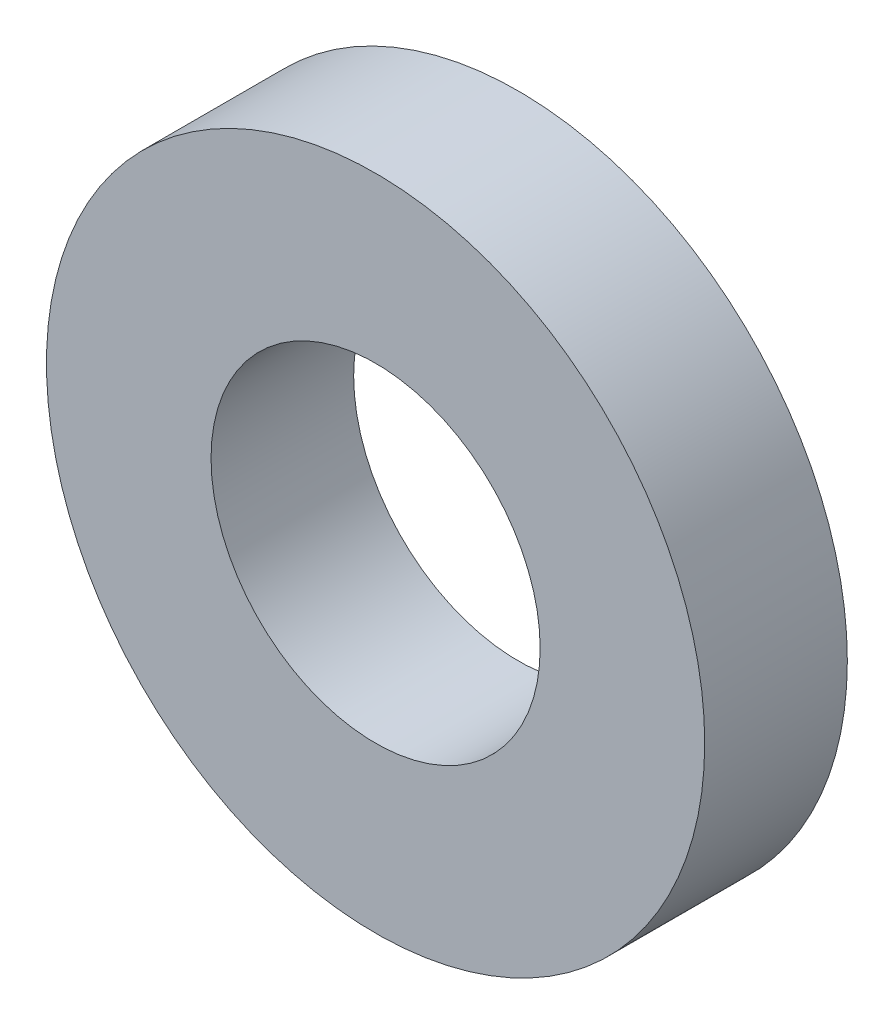
ISO-10303-21;
HEADER;
FILE_DESCRIPTION(('STEP AP214'),'2;1');
FILE_NAME('part.step','',(''),(''),'','','');
FILE_SCHEMA(('AUTOMOTIVE_DESIGN { 1 0 10303 214 1 1 1 1 }'));
ENDSEC;
DATA;
#1=APPLICATION_CONTEXT('core data for automotive mechanical design processes');
#2=APPLICATION_PROTOCOL_DEFINITION('international standard','automotive_design',2000,#1);
#3=PRODUCT_CONTEXT('',#1,'mechanical');
#4=PRODUCT('Part','Part','',(#3));
#5=PRODUCT_RELATED_PRODUCT_CATEGORY('part','',(#4));
#6=PRODUCT_DEFINITION_FORMATION('','',#4);
#7=PRODUCT_DEFINITION_CONTEXT('part definition',#1,'design');
#8=PRODUCT_DEFINITION('design','',#6,#7);
#9=PRODUCT_DEFINITION_SHAPE('','',#8);
#10=(LENGTH_UNIT() NAMED_UNIT(*) SI_UNIT(.MILLI.,.METRE.));
#11=(NAMED_UNIT(*) PLANE_ANGLE_UNIT() SI_UNIT($,.RADIAN.));
#12=(NAMED_UNIT(*) SI_UNIT($,.STERADIAN.) SOLID_ANGLE_UNIT());
#13=UNCERTAINTY_MEASURE_WITH_UNIT(LENGTH_MEASURE(1.E-05),#10,'distance_accuracy_value','');
#14=(GEOMETRIC_REPRESENTATION_CONTEXT(3) GLOBAL_UNCERTAINTY_ASSIGNED_CONTEXT((#13)) GLOBAL_UNIT_ASSIGNED_CONTEXT((#10,
#11,#12)) REPRESENTATION_CONTEXT('',''));
#15=CARTESIAN_POINT('',(0.,0.,0.));
#16=DIRECTION('',(0.,0.,1.));
#17=DIRECTION('',(1.,0.,0.));
#18=AXIS2_PLACEMENT_3D('',#15,#16,#17);
#19=CARTESIAN_POINT('',(0.,0.,0.65));
#20=DIRECTION('',(0.,0.,1.));
#21=DIRECTION('',(1.,0.,0.));
#22=AXIS2_PLACEMENT_3D('',#19,#20,#21);
#23=PLANE('',#22);
#24=CARTESIAN_POINT('',(0.,0.,0.65));
#25=DIRECTION('',(0.,0.,1.));
#26=DIRECTION('',(1.,0.,0.));
#27=AXIS2_PLACEMENT_3D('',#24,#25,#26);
#28=CIRCLE('',#27,3.);
#29=CARTESIAN_POINT('',(3.,0.,0.65));
#30=VERTEX_POINT('',#29);
#31=EDGE_CURVE('E10',#30,#30,#28,.T.);
#32=ORIENTED_EDGE('',*,*,#31,.T.);
#33=EDGE_LOOP('',(#32));
#34=FACE_BOUND('',#33,.T.);
#35=CARTESIAN_POINT('',(0.,0.,0.65));
#36=DIRECTION('',(0.,0.,1.));
#37=DIRECTION('',(1.,0.,0.));
#38=AXIS2_PLACEMENT_3D('',#35,#36,#37);
#39=CIRCLE('',#38,1.5);
#40=CARTESIAN_POINT('',(1.5,0.,0.65));
#41=VERTEX_POINT('',#40);
#42=EDGE_CURVE('E50',#41,#41,#39,.T.);
#43=ORIENTED_EDGE('',*,*,#42,.F.);
#44=EDGE_LOOP('',(#43));
#45=FACE_BOUND('',#44,.T.);
#46=ADVANCED_FACE('F37',(#34,#45),#23,.T.);
#47=CARTESIAN_POINT('',(0.,0.,-0.65));
#48=DIRECTION('',(0.,0.,1.));
#49=DIRECTION('',(1.,0.,0.));
#50=AXIS2_PLACEMENT_3D('',#47,#48,#49);
#51=PLANE('',#50);
#52=CARTESIAN_POINT('',(0.,0.,-0.65));
#53=DIRECTION('',(0.,0.,1.));
#54=DIRECTION('',(1.,0.,0.));
#55=AXIS2_PLACEMENT_3D('',#52,#53,#54);
#56=CIRCLE('',#55,3.);
#57=CARTESIAN_POINT('',(3.,0.,-0.65));
#58=VERTEX_POINT('',#57);
#59=EDGE_CURVE('E41',#58,#58,#56,.T.);
#60=ORIENTED_EDGE('',*,*,#59,.F.);
#61=EDGE_LOOP('',(#60));
#62=FACE_BOUND('',#61,.T.);
#63=CARTESIAN_POINT('',(0.,0.,-0.65));
#64=DIRECTION('',(0.,0.,1.));
#65=DIRECTION('',(1.,0.,0.));
#66=AXIS2_PLACEMENT_3D('',#63,#64,#65);
#67=CIRCLE('',#66,1.5);
#68=CARTESIAN_POINT('',(1.5,0.,-0.65));
#69=VERTEX_POINT('',#68);
#70=EDGE_CURVE('E52',#69,#69,#67,.T.);
#71=ORIENTED_EDGE('',*,*,#70,.T.);
#72=EDGE_LOOP('',(#71));
#73=FACE_BOUND('',#72,.T.);
#74=ADVANCED_FACE('F64',(#62,#73),#51,.F.);
#75=CARTESIAN_POINT('',(0.,0.,0.65));
#76=DIRECTION('',(0.,0.,-1.));
#77=DIRECTION('',(-1.,0.,0.));
#78=AXIS2_PLACEMENT_3D('',#75,#76,#77);
#79=CYLINDRICAL_SURFACE('',#78,3.);
#80=ORIENTED_EDGE('',*,*,#31,.F.);
#81=EDGE_LOOP('',(#80));
#82=FACE_BOUND('',#81,.T.);
#83=ORIENTED_EDGE('',*,*,#59,.T.);
#84=EDGE_LOOP('',(#83));
#85=FACE_BOUND('',#84,.T.);
#86=ADVANCED_FACE('F39',(#82,#85),#79,.T.);
#87=CARTESIAN_POINT('',(0.,0.,0.65));
#88=DIRECTION('',(0.,0.,-1.));
#89=DIRECTION('',(-1.,0.,0.));
#90=AXIS2_PLACEMENT_3D('',#87,#88,#89);
#91=CYLINDRICAL_SURFACE('',#90,1.5);
#92=ORIENTED_EDGE('',*,*,#42,.T.);
#93=EDGE_LOOP('',(#92));
#94=FACE_BOUND('',#93,.T.);
#95=ORIENTED_EDGE('',*,*,#70,.F.);
#96=EDGE_LOOP('',(#95));
#97=FACE_BOUND('',#96,.T.);
#98=ADVANCED_FACE('F60',(#94,#97),#91,.F.);
#99=CLOSED_SHELL('',(#46,#74,#86,#98));
#100=MANIFOLD_SOLID_BREP('B2',#99);
#101=ADVANCED_BREP_SHAPE_REPRESENTATION('',(#18,#100),#14);
#102=SHAPE_DEFINITION_REPRESENTATION(#9,#101);
ENDSEC;
END-ISO-10303-21;
